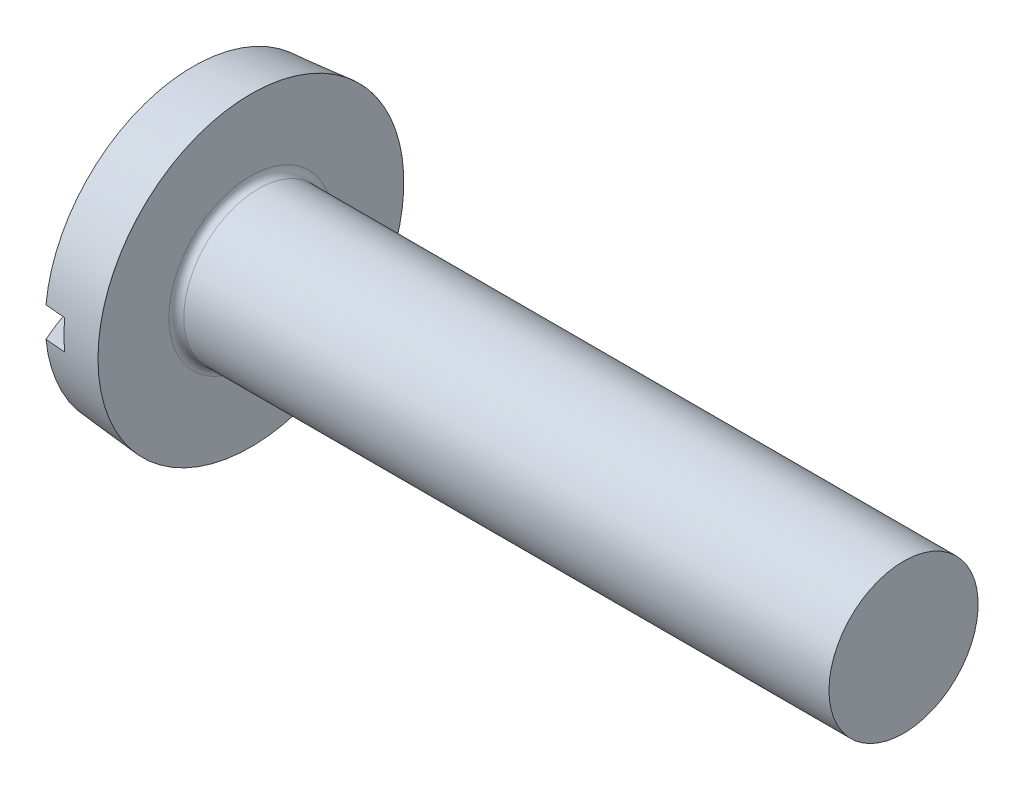
ISO-10303-21;
HEADER;
FILE_DESCRIPTION(('STEP AP214'),'2;1');
FILE_NAME('part.step','',(''),(''),'','','');
FILE_SCHEMA(('AUTOMOTIVE_DESIGN { 1 0 10303 214 1 1 1 1 }'));
ENDSEC;
DATA;
#1=APPLICATION_CONTEXT('core data for automotive mechanical design processes');
#2=APPLICATION_PROTOCOL_DEFINITION('international standard','automotive_design',2000,#1);
#3=PRODUCT_CONTEXT('',#1,'mechanical');
#4=PRODUCT('Part','Part','',(#3));
#5=PRODUCT_RELATED_PRODUCT_CATEGORY('part','',(#4));
#6=PRODUCT_DEFINITION_FORMATION('','',#4);
#7=PRODUCT_DEFINITION_CONTEXT('part definition',#1,'design');
#8=PRODUCT_DEFINITION('design','',#6,#7);
#9=PRODUCT_DEFINITION_SHAPE('','',#8);
#10=(LENGTH_UNIT() NAMED_UNIT(*) SI_UNIT(.MILLI.,.METRE.));
#11=(NAMED_UNIT(*) PLANE_ANGLE_UNIT() SI_UNIT($,.RADIAN.));
#12=(NAMED_UNIT(*) SI_UNIT($,.STERADIAN.) SOLID_ANGLE_UNIT());
#13=UNCERTAINTY_MEASURE_WITH_UNIT(LENGTH_MEASURE(1.E-05),#10,'distance_accuracy_value','');
#14=(GEOMETRIC_REPRESENTATION_CONTEXT(3) GLOBAL_UNCERTAINTY_ASSIGNED_CONTEXT((#13)) GLOBAL_UNIT_ASSIGNED_CONTEXT((#10,
#11,#12)) REPRESENTATION_CONTEXT('',''));
#15=CARTESIAN_POINT('',(0.,0.,0.));
#16=DIRECTION('',(0.,0.,1.));
#17=DIRECTION('',(1.,0.,0.));
#18=AXIS2_PLACEMENT_3D('',#15,#16,#17);
#19=CARTESIAN_POINT('',(19.343972996088,0.,0.));
#20=DIRECTION('',(-1.,0.,0.));
#21=DIRECTION('',(0.,1.,0.));
#22=AXIS2_PLACEMENT_3D('',#19,#20,#21);
#23=SPHERICAL_SURFACE('',#22,19.343972996088);
#24=CARTESIAN_POINT('',(1.7,0.,0.));
#25=DIRECTION('',(-1.,0.,0.));
#26=DIRECTION('',(0.,0.,1.));
#27=AXIS2_PLACEMENT_3D('',#24,#25,#26);
#28=CIRCLE('',#27,7.92966002970488);
#29=CARTESIAN_POINT('',(1.7,-0.8,-7.88920199935959));
#30=VERTEX_POINT('',#29);
#31=CARTESIAN_POINT('',(1.7,-0.8,7.88920199935958));
#32=VERTEX_POINT('',#31);
#33=EDGE_CURVE('E114',#30,#32,#28,.T.);
#34=ORIENTED_EDGE('',*,*,#33,.T.);
#35=CARTESIAN_POINT('',(19.343972996088,-0.8,0.));
#36=DIRECTION('',(0.,1.,0.));
#37=DIRECTION('',(0.,0.,1.));
#38=AXIS2_PLACEMENT_3D('',#35,#36,#37);
#39=CIRCLE('',#38,19.3274232962747);
#40=EDGE_CURVE('E81',#32,#30,#39,.F.);
#41=ORIENTED_EDGE('',*,*,#40,.T.);
#42=EDGE_LOOP('',(#34,#41));
#43=FACE_BOUND('',#42,.T.);
#44=ADVANCED_FACE('F34',(#43),#23,.T.);
#45=CARTESIAN_POINT('',(1.7,0.799999999999998,7.88920199935958));
#46=VERTEX_POINT('',#45);
#47=CARTESIAN_POINT('',(1.7,0.8,-7.88920199935959));
#48=VERTEX_POINT('',#47);
#49=EDGE_CURVE('E111',#46,#48,#28,.T.);
#50=ORIENTED_EDGE('',*,*,#49,.T.);
#51=CARTESIAN_POINT('',(19.343972996088,0.799999999999999,0.));
#52=DIRECTION('',(0.,-1.,0.));
#53=DIRECTION('',(0.,0.,-1.));
#54=AXIS2_PLACEMENT_3D('',#51,#52,#53);
#55=CIRCLE('',#54,19.3274232962747);
#56=EDGE_CURVE('E122',#48,#46,#55,.F.);
#57=ORIENTED_EDGE('',*,*,#56,.T.);
#58=EDGE_LOOP('',(#50,#57));
#59=FACE_BOUND('',#58,.T.);
#60=ADVANCED_FACE('F128',(#59),#23,.T.);
#61=CARTESIAN_POINT('',(4.79,0.,0.));
#62=DIRECTION('',(1.,0.,0.));
#63=DIRECTION('',(0.,0.,-1.));
#64=AXIS2_PLACEMENT_3D('',#61,#62,#63);
#65=CONICAL_SURFACE('',#64,8.2,0.0872664625997201);
#66=CARTESIAN_POINT('',(4.79,0.,0.));
#67=DIRECTION('',(-1.,0.,0.));
#68=DIRECTION('',(0.,0.,1.));
#69=AXIS2_PLACEMENT_3D('',#66,#67,#68);
#70=CIRCLE('',#69,8.2);
#71=CARTESIAN_POINT('',(4.79,0.,8.2));
#72=VERTEX_POINT('',#71);
#73=EDGE_CURVE('E115',#72,#72,#70,.T.);
#74=ORIENTED_EDGE('',*,*,#73,.T.);
#75=EDGE_LOOP('',(#74));
#76=FACE_BOUND('',#75,.T.);
#77=CARTESIAN_POINT('',(-12.5012868951016,-0.8,6.63918341649504));
#78=CARTESIAN_POINT('',(-8.41637899598243,-0.8,6.99913537394286));
#79=CARTESIAN_POINT('',(-4.33143795364338,-0.8,7.35871084064432));
#80=CARTESIAN_POINT('',(0.533525426474249,-0.8,7.78662192533136));
#81=CARTESIAN_POINT('',(1.31352477144077,-0.8,7.85521892211173));
#82=CARTESIAN_POINT('',(6.95849874100361,-0.8,8.35159903868396));
#83=CARTESIAN_POINT('',(11.8235038926122,-0.8,8.77903505912143));
#84=CARTESIAN_POINT('',(16.6885247005002,-0.8,9.2062925597299));
#85=B_SPLINE_CURVE_WITH_KNOTS('',3,(#77,#78,#79,#80,#81,#82,#83,#84),.UNSPECIFIED.,.F.,.F.,(4,2,
2,4),(0.,12.3022087481775,14.6512384913206,29.302476949663),.UNSPECIFIED.);
#86=CARTESIAN_POINT('',(2.8,-0.8,7.98592709939972));
#87=VERTEX_POINT('',#86);
#88=EDGE_CURVE('E11',#32,#87,#85,.T.);
#89=ORIENTED_EDGE('',*,*,#88,.F.);
#90=ORIENTED_EDGE('',*,*,#33,.F.);
#91=CARTESIAN_POINT('',(16.6885247005002,-0.8,-9.2062925597299));
#92=CARTESIAN_POINT('',(14.2560135638509,-0.8,-8.99267204172141));
#93=CARTESIAN_POINT('',(11.8235070425581,-0.8,-8.77899895060455));
#94=CARTESIAN_POINT('',(6.95850614820418,-0.8,-8.35151466911596));
#95=CARTESIAN_POINT('',(4.52601177514299,-0.8,-8.13770347874497));
#96=CARTESIAN_POINT('',(-0.338961937287395,-0.8,-7.70991004289475));
#97=CARTESIAN_POINT('',(-2.77144127665655,-0.8,-7.49592779741509));
#98=CARTESIAN_POINT('',(-7.63638014400966,-0.8,-7.06773807459033));
#99=CARTESIAN_POINT('',(-10.0688396719935,-0.8,-6.85353059724398));
#100=CARTESIAN_POINT('',(-12.5012868951016,-0.8,-6.63918341649504));
#101=B_SPLINE_CURVE_WITH_KNOTS('',3,(#91,#92,#93,#94,#95,#96,#97,#98,#99,#100),.UNSPECIFIED.,
.F.,.F.,(4,2,2,2,4),(0.,7.32561925189288,14.6512384642453,21.9768576940625,29.3024769637411),.UNSPECIFIED.);
#102=CARTESIAN_POINT('',(2.8,-0.8,-7.98592709939972));
#103=VERTEX_POINT('',#102);
#104=EDGE_CURVE('E62',#103,#30,#101,.T.);
#105=ORIENTED_EDGE('',*,*,#104,.F.);
#106=CARTESIAN_POINT('',(2.8,0.,0.));
#107=DIRECTION('',(1.,0.,0.));
#108=DIRECTION('',(0.,0.,-1.));
#109=AXIS2_PLACEMENT_3D('',#106,#107,#108);
#110=CIRCLE('',#109,8.0258975595834);
#111=CARTESIAN_POINT('',(2.8,0.8,-7.98592709939972));
#112=VERTEX_POINT('',#111);
#113=EDGE_CURVE('E89',#103,#112,#110,.T.);
#114=ORIENTED_EDGE('',*,*,#113,.T.);
#115=CARTESIAN_POINT('',(-12.5012868951016,0.8,-6.63918341649504));
#116=CARTESIAN_POINT('',(-8.41637899598243,0.8,-6.99913537394286));
#117=CARTESIAN_POINT('',(-4.33143795364338,0.8,-7.35871084064432));
#118=CARTESIAN_POINT('',(0.533525426474249,0.8,-7.78662192533136));
#119=CARTESIAN_POINT('',(1.31352477144077,0.8,-7.85521892211173));
#120=CARTESIAN_POINT('',(6.95849874100361,0.8,-8.35159903868396));
#121=CARTESIAN_POINT('',(11.8235038926122,0.8,-8.77903505912143));
#122=CARTESIAN_POINT('',(16.6885247005002,0.8,-9.2062925597299));
#123=B_SPLINE_CURVE_WITH_KNOTS('',3,(#115,#116,#117,#118,#119,#120,#121,#122),.UNSPECIFIED.,.F.,
.F.,(4,2,2,4),(0.,12.3022087481775,14.6512384913206,29.302476949663),.UNSPECIFIED.);
#124=EDGE_CURVE('E95',#48,#112,#123,.T.);
#125=ORIENTED_EDGE('',*,*,#124,.F.);
#126=ORIENTED_EDGE('',*,*,#49,.F.);
#127=CARTESIAN_POINT('',(16.6885247005002,0.799999999999998,9.2062925597299));
#128=CARTESIAN_POINT('',(14.2560135638509,0.799999999999998,8.99267204172141));
#129=CARTESIAN_POINT('',(11.8235070425581,0.799999999999998,8.77899895060455));
#130=CARTESIAN_POINT('',(6.95850614820418,0.799999999999998,8.35151466911596));
#131=CARTESIAN_POINT('',(4.52601177514299,0.799999999999998,8.13770347874497));
#132=CARTESIAN_POINT('',(-0.338961937287397,0.799999999999998,7.70991004289475));
#133=CARTESIAN_POINT('',(-2.77144127665656,0.799999999999998,7.49592779741509));
#134=CARTESIAN_POINT('',(-7.63638014400966,0.799999999999998,7.06773807459033));
#135=CARTESIAN_POINT('',(-10.0688396719935,0.799999999999998,6.85353059724398));
#136=CARTESIAN_POINT('',(-12.5012868951016,0.799999999999998,6.63918341649504));
#137=B_SPLINE_CURVE_WITH_KNOTS('',3,(#127,#128,#129,#130,#131,#132,#133,#134,#135,#136),
.UNSPECIFIED.,.F.,.F.,(4,2,2,2,4),(0.,7.32561925189288,14.6512384642453,21.9768576940625,
29.3024769637411),.UNSPECIFIED.);
#138=CARTESIAN_POINT('',(2.8,0.799999999999998,7.98592709939972));
#139=VERTEX_POINT('',#138);
#140=EDGE_CURVE('E47',#139,#46,#137,.T.);
#141=ORIENTED_EDGE('',*,*,#140,.F.);
#142=EDGE_CURVE('E87',#139,#87,#110,.T.);
#143=ORIENTED_EDGE('',*,*,#142,.T.);
#144=EDGE_LOOP('',(#89,#90,#105,#114,#125,#126,#141,#143));
#145=FACE_BOUND('',#144,.T.);
#146=ADVANCED_FACE('F92',(#76,#145),#65,.T.);
#147=CARTESIAN_POINT('',(-25.4,0.,0.));
#148=DIRECTION('',(-1.,0.,0.));
#149=DIRECTION('',(0.,0.,1.));
#150=AXIS2_PLACEMENT_3D('',#147,#148,#149);
#151=CYLINDRICAL_SURFACE('',#150,4.);
#152=CARTESIAN_POINT('',(5.2,0.,0.));
#153=DIRECTION('',(-1.,0.,0.));
#154=DIRECTION('',(0.,0.,1.));
#155=AXIS2_PLACEMENT_3D('',#152,#153,#154);
#156=CIRCLE('',#155,4.);
#157=CARTESIAN_POINT('',(5.2,0.,4.));
#158=VERTEX_POINT('',#157);
#159=EDGE_CURVE('E99',#158,#158,#156,.F.);
#160=ORIENTED_EDGE('',*,*,#159,.T.);
#161=EDGE_LOOP('',(#160));
#162=FACE_BOUND('',#161,.T.);
#163=CARTESIAN_POINT('',(39.8,0.,0.));
#164=DIRECTION('',(-1.,0.,0.));
#165=DIRECTION('',(0.,0.,1.));
#166=AXIS2_PLACEMENT_3D('',#163,#164,#165);
#167=CIRCLE('',#166,4.);
#168=CARTESIAN_POINT('',(39.8,0.,4.));
#169=VERTEX_POINT('',#168);
#170=EDGE_CURVE('E106',#169,#169,#167,.T.);
#171=ORIENTED_EDGE('',*,*,#170,.T.);
#172=EDGE_LOOP('',(#171));
#173=FACE_BOUND('',#172,.T.);
#174=ADVANCED_FACE('F135',(#162,#173),#151,.T.);
#175=CARTESIAN_POINT('',(39.8,4.,0.));
#176=DIRECTION('',(1.,0.,0.));
#177=DIRECTION('',(0.,0.,-1.));
#178=AXIS2_PLACEMENT_3D('',#175,#176,#177);
#179=PLANE('',#178);
#180=ORIENTED_EDGE('',*,*,#170,.F.);
#181=EDGE_LOOP('',(#180));
#182=FACE_BOUND('',#181,.T.);
#183=ADVANCED_FACE('F141',(#182),#179,.T.);
#184=CARTESIAN_POINT('',(-25.4,0.,0.));
#185=DIRECTION('',(-1.,0.,0.));
#186=DIRECTION('',(0.,0.,1.));
#187=AXIS2_PLACEMENT_3D('',#184,#185,#186);
#188=CYLINDRICAL_SURFACE('',#187,8.2);
#189=ORIENTED_EDGE('',*,*,#73,.F.);
#190=EDGE_LOOP('',(#189));
#191=FACE_BOUND('',#190,.T.);
#192=CARTESIAN_POINT('',(4.8,0.,0.));
#193=DIRECTION('',(-1.,0.,0.));
#194=DIRECTION('',(0.,0.,1.));
#195=AXIS2_PLACEMENT_3D('',#192,#193,#194);
#196=CIRCLE('',#195,8.2);
#197=CARTESIAN_POINT('',(4.8,0.,8.2));
#198=VERTEX_POINT('',#197);
#199=EDGE_CURVE('E118',#198,#198,#196,.T.);
#200=ORIENTED_EDGE('',*,*,#199,.T.);
#201=EDGE_LOOP('',(#200));
#202=FACE_BOUND('',#201,.T.);
#203=ADVANCED_FACE('F143',(#191,#202),#188,.T.);
#204=CARTESIAN_POINT('',(4.8,4.,0.));
#205=DIRECTION('',(-1.,0.,0.));
#206=DIRECTION('',(0.,0.,1.));
#207=AXIS2_PLACEMENT_3D('',#204,#205,#206);
#208=PLANE('',#207);
#209=CARTESIAN_POINT('',(4.8,0.,0.));
#210=DIRECTION('',(-1.,0.,0.));
#211=DIRECTION('',(0.,0.,1.));
#212=AXIS2_PLACEMENT_3D('',#209,#210,#211);
#213=CIRCLE('',#212,4.4);
#214=CARTESIAN_POINT('',(4.8,0.,4.4));
#215=VERTEX_POINT('',#214);
#216=EDGE_CURVE('E102',#215,#215,#213,.T.);
#217=ORIENTED_EDGE('',*,*,#216,.T.);
#218=EDGE_LOOP('',(#217));
#219=FACE_BOUND('',#218,.T.);
#220=ORIENTED_EDGE('',*,*,#199,.F.);
#221=EDGE_LOOP('',(#220));
#222=FACE_BOUND('',#221,.T.);
#223=ADVANCED_FACE('F162',(#219,#222),#208,.F.);
#224=CARTESIAN_POINT('',(5.2,0.,0.));
#225=DIRECTION('',(-1.,0.,0.));
#226=DIRECTION('',(0.,0.,1.));
#227=AXIS2_PLACEMENT_3D('',#224,#225,#226);
#228=TOROIDAL_SURFACE('',#227,4.4,0.4);
#229=ORIENTED_EDGE('',*,*,#159,.F.);
#230=EDGE_LOOP('',(#229));
#231=FACE_BOUND('',#230,.T.);
#232=ORIENTED_EDGE('',*,*,#216,.F.);
#233=EDGE_LOOP('',(#232));
#234=FACE_BOUND('',#233,.T.);
#235=ADVANCED_FACE('F36',(#231,#234),#228,.F.);
#236=CARTESIAN_POINT('',(2.8,-0.8,8.2));
#237=DIRECTION('',(0.,1.,0.));
#238=DIRECTION('',(0.,0.,1.));
#239=AXIS2_PLACEMENT_3D('',#236,#237,#238);
#240=PLANE('',#239);
#241=ORIENTED_EDGE('',*,*,#104,.T.);
#242=ORIENTED_EDGE('',*,*,#40,.F.);
#243=ORIENTED_EDGE('',*,*,#88,.T.);
#244=DIRECTION('',(0.,0.,-1.));
#245=VECTOR('',#244,1.);
#246=CARTESIAN_POINT('',(2.8,-0.8,8.2));
#247=LINE('',#246,#245);
#248=EDGE_CURVE('E80',#87,#103,#247,.T.);
#249=ORIENTED_EDGE('',*,*,#248,.T.);
#250=EDGE_LOOP('',(#241,#242,#243,#249));
#251=FACE_BOUND('',#250,.T.);
#252=ADVANCED_FACE('F79',(#251),#240,.T.);
#253=CARTESIAN_POINT('',(2.8,0.8,-8.2));
#254=DIRECTION('',(0.,-1.,0.));
#255=DIRECTION('',(0.,0.,-1.));
#256=AXIS2_PLACEMENT_3D('',#253,#254,#255);
#257=PLANE('',#256);
#258=ORIENTED_EDGE('',*,*,#124,.T.);
#259=DIRECTION('',(0.,0.,1.));
#260=VECTOR('',#259,1.);
#261=CARTESIAN_POINT('',(2.8,0.8,-8.2));
#262=LINE('',#261,#260);
#263=EDGE_CURVE('E54',#112,#139,#262,.T.);
#264=ORIENTED_EDGE('',*,*,#263,.T.);
#265=ORIENTED_EDGE('',*,*,#140,.T.);
#266=ORIENTED_EDGE('',*,*,#56,.F.);
#267=EDGE_LOOP('',(#258,#264,#265,#266));
#268=FACE_BOUND('',#267,.T.);
#269=ADVANCED_FACE('F126',(#268),#257,.T.);
#270=CARTESIAN_POINT('',(2.8,-0.8,-8.2));
#271=DIRECTION('',(1.,0.,0.));
#272=DIRECTION('',(0.,0.,-1.));
#273=AXIS2_PLACEMENT_3D('',#270,#271,#272);
#274=PLANE('',#273);
#275=ORIENTED_EDGE('',*,*,#263,.F.);
#276=ORIENTED_EDGE('',*,*,#113,.F.);
#277=ORIENTED_EDGE('',*,*,#248,.F.);
#278=ORIENTED_EDGE('',*,*,#142,.F.);
#279=EDGE_LOOP('',(#275,#276,#277,#278));
#280=FACE_BOUND('',#279,.T.);
#281=ADVANCED_FACE('F86',(#280),#274,.F.);
#282=CLOSED_SHELL('',(#44,#60,#146,#174,#183,#203,#223,#235,#252,#269,#281));
#283=MANIFOLD_SOLID_BREP('B2',#282);
#284=ADVANCED_BREP_SHAPE_REPRESENTATION('',(#18,#283),#14);
#285=SHAPE_DEFINITION_REPRESENTATION(#9,#284);
ENDSEC;
END-ISO-10303-21;
